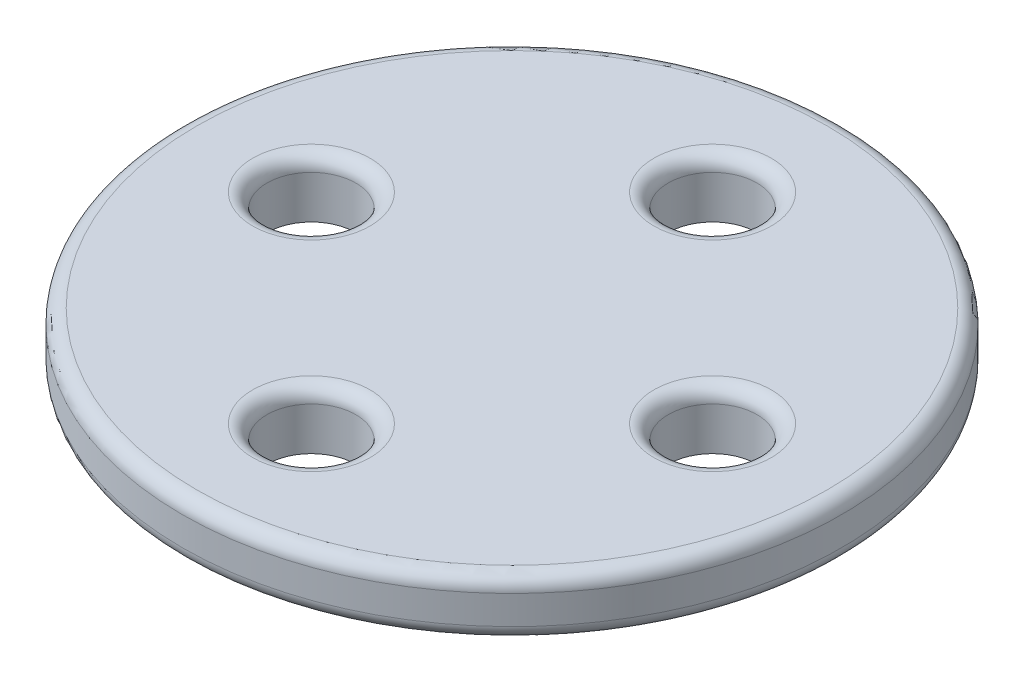
ISO-10303-21;
HEADER;
FILE_DESCRIPTION(('STEP AP214'),'2;1');
FILE_NAME('part.step','',(''),(''),'','','');
FILE_SCHEMA(('AUTOMOTIVE_DESIGN { 1 0 10303 214 1 1 1 1 }'));
ENDSEC;
DATA;
#1=APPLICATION_CONTEXT('core data for automotive mechanical design processes');
#2=APPLICATION_PROTOCOL_DEFINITION('international standard','automotive_design',2000,#1);
#3=PRODUCT_CONTEXT('',#1,'mechanical');
#4=PRODUCT('Part','Part','',(#3));
#5=PRODUCT_RELATED_PRODUCT_CATEGORY('part','',(#4));
#6=PRODUCT_DEFINITION_FORMATION('','',#4);
#7=PRODUCT_DEFINITION_CONTEXT('part definition',#1,'design');
#8=PRODUCT_DEFINITION('design','',#6,#7);
#9=PRODUCT_DEFINITION_SHAPE('','',#8);
#10=(LENGTH_UNIT() NAMED_UNIT(*) SI_UNIT(.MILLI.,.METRE.));
#11=(NAMED_UNIT(*) PLANE_ANGLE_UNIT() SI_UNIT($,.RADIAN.));
#12=(NAMED_UNIT(*) SI_UNIT($,.STERADIAN.) SOLID_ANGLE_UNIT());
#13=UNCERTAINTY_MEASURE_WITH_UNIT(LENGTH_MEASURE(1.E-05),#10,'distance_accuracy_value','');
#14=(GEOMETRIC_REPRESENTATION_CONTEXT(3) GLOBAL_UNCERTAINTY_ASSIGNED_CONTEXT((#13)) GLOBAL_UNIT_ASSIGNED_CONTEXT((#10,
#11,#12)) REPRESENTATION_CONTEXT('',''));
#15=CARTESIAN_POINT('',(0.,0.,0.));
#16=DIRECTION('',(0.,0.,1.));
#17=DIRECTION('',(1.,0.,0.));
#18=AXIS2_PLACEMENT_3D('',#15,#16,#17);
#19=CARTESIAN_POINT('',(0.,2.,0.));
#20=DIRECTION('',(0.,1.,0.));
#21=DIRECTION('',(0.,0.,1.));
#22=AXIS2_PLACEMENT_3D('',#19,#20,#21);
#23=PLANE('',#22);
#24=CARTESIAN_POINT('',(-6.99999999999982,2.,1.84544747626273E-13));
#25=DIRECTION('',(0.,1.,0.));
#26=DIRECTION('',(0.,0.,1.));
#27=AXIS2_PLACEMENT_3D('',#24,#25,#26);
#28=CIRCLE('',#27,2.05);
#29=CARTESIAN_POINT('',(-6.99999999999982,2.,2.05000000000019));
#30=VERTEX_POINT('',#29);
#31=EDGE_CURVE('E60',#30,#30,#28,.F.);
#32=ORIENTED_EDGE('',*,*,#31,.T.);
#33=EDGE_LOOP('',(#32));
#34=FACE_BOUND('',#33,.T.);
#35=CARTESIAN_POINT('',(7.00000000000018,2.,-1.8368749486687E-13));
#36=DIRECTION('',(0.,1.,0.));
#37=DIRECTION('',(0.,0.,1.));
#38=AXIS2_PLACEMENT_3D('',#35,#36,#37);
#39=CIRCLE('',#38,2.05);
#40=CARTESIAN_POINT('',(7.00000000000018,2.,2.04999999999982));
#41=VERTEX_POINT('',#40);
#42=EDGE_CURVE('E63',#41,#41,#39,.F.);
#43=ORIENTED_EDGE('',*,*,#42,.T.);
#44=EDGE_LOOP('',(#43));
#45=FACE_BOUND('',#44,.T.);
#46=CARTESIAN_POINT('',(0.,2.,0.));
#47=DIRECTION('',(0.,1.,0.));
#48=DIRECTION('',(0.,0.,1.));
#49=AXIS2_PLACEMENT_3D('',#46,#47,#48);
#50=CIRCLE('',#49,11.);
#51=CARTESIAN_POINT('',(0.,2.,11.));
#52=VERTEX_POINT('',#51);
#53=EDGE_CURVE('E66',#52,#52,#50,.T.);
#54=ORIENTED_EDGE('',*,*,#53,.T.);
#55=EDGE_LOOP('',(#54));
#56=FACE_BOUND('',#55,.T.);
#57=CARTESIAN_POINT('',(0.,2.,-7.));
#58=DIRECTION('',(0.,1.,0.));
#59=DIRECTION('',(0.,0.,1.));
#60=AXIS2_PLACEMENT_3D('',#57,#58,#59);
#61=CIRCLE('',#60,2.05);
#62=CARTESIAN_POINT('',(0.,2.,-4.95));
#63=VERTEX_POINT('',#62);
#64=EDGE_CURVE('E69',#63,#63,#61,.F.);
#65=ORIENTED_EDGE('',*,*,#64,.T.);
#66=EDGE_LOOP('',(#65));
#67=FACE_BOUND('',#66,.T.);
#68=CARTESIAN_POINT('',(3.67313757393783E-13,2.,7.));
#69=DIRECTION('',(0.,1.,0.));
#70=DIRECTION('',(0.,0.,1.));
#71=AXIS2_PLACEMENT_3D('',#68,#69,#70);
#72=CIRCLE('',#71,2.05);
#73=CARTESIAN_POINT('',(3.67313757393783E-13,2.,9.05));
#74=VERTEX_POINT('',#73);
#75=EDGE_CURVE('E72',#74,#74,#72,.F.);
#76=ORIENTED_EDGE('',*,*,#75,.T.);
#77=EDGE_LOOP('',(#76));
#78=FACE_BOUND('',#77,.T.);
#79=ADVANCED_FACE('F34',(#34,#45,#56,#67,#78),#23,.T.);
#80=CARTESIAN_POINT('',(0.,0.,0.));
#81=DIRECTION('',(0.,1.,0.));
#82=DIRECTION('',(0.,0.,1.));
#83=AXIS2_PLACEMENT_3D('',#80,#81,#82);
#84=PLANE('',#83);
#85=CARTESIAN_POINT('',(0.,0.,0.));
#86=DIRECTION('',(0.,1.,0.));
#87=DIRECTION('',(0.,0.,1.));
#88=AXIS2_PLACEMENT_3D('',#85,#86,#87);
#89=CIRCLE('',#88,11.);
#90=CARTESIAN_POINT('',(0.,0.,11.));
#91=VERTEX_POINT('',#90);
#92=EDGE_CURVE('E10',#91,#91,#89,.F.);
#93=ORIENTED_EDGE('',*,*,#92,.T.);
#94=EDGE_LOOP('',(#93));
#95=FACE_BOUND('',#94,.T.);
#96=CARTESIAN_POINT('',(0.,0.,-7.));
#97=DIRECTION('',(0.,1.,0.));
#98=DIRECTION('',(0.,0.,1.));
#99=AXIS2_PLACEMENT_3D('',#96,#97,#98);
#100=CIRCLE('',#99,1.55);
#101=CARTESIAN_POINT('',(0.,0.,-5.45));
#102=VERTEX_POINT('',#101);
#103=EDGE_CURVE('E78',#102,#102,#100,.T.);
#104=ORIENTED_EDGE('',*,*,#103,.T.);
#105=EDGE_LOOP('',(#104));
#106=FACE_BOUND('',#105,.T.);
#107=CARTESIAN_POINT('',(7.00000000000018,0.,-1.8368749486687E-13));
#108=DIRECTION('',(0.,1.,0.));
#109=DIRECTION('',(0.,0.,1.));
#110=AXIS2_PLACEMENT_3D('',#107,#108,#109);
#111=CIRCLE('',#110,1.55);
#112=CARTESIAN_POINT('',(7.00000000000018,0.,1.54999999999982));
#113=VERTEX_POINT('',#112);
#114=EDGE_CURVE('E81',#113,#113,#111,.T.);
#115=ORIENTED_EDGE('',*,*,#114,.T.);
#116=EDGE_LOOP('',(#115));
#117=FACE_BOUND('',#116,.T.);
#118=CARTESIAN_POINT('',(3.67313757393783E-13,0.,7.));
#119=DIRECTION('',(0.,1.,0.));
#120=DIRECTION('',(0.,0.,1.));
#121=AXIS2_PLACEMENT_3D('',#118,#119,#120);
#122=CIRCLE('',#121,1.55);
#123=CARTESIAN_POINT('',(3.67313757393783E-13,0.,8.55));
#124=VERTEX_POINT('',#123);
#125=EDGE_CURVE('E84',#124,#124,#122,.T.);
#126=ORIENTED_EDGE('',*,*,#125,.T.);
#127=EDGE_LOOP('',(#126));
#128=FACE_BOUND('',#127,.T.);
#129=CARTESIAN_POINT('',(-6.99999999999982,0.,1.84544747626273E-13));
#130=DIRECTION('',(0.,1.,0.));
#131=DIRECTION('',(0.,0.,1.));
#132=AXIS2_PLACEMENT_3D('',#129,#130,#131);
#133=CIRCLE('',#132,1.55);
#134=CARTESIAN_POINT('',(-6.99999999999982,0.,1.55000000000018));
#135=VERTEX_POINT('',#134);
#136=EDGE_CURVE('E87',#135,#135,#133,.T.);
#137=ORIENTED_EDGE('',*,*,#136,.T.);
#138=EDGE_LOOP('',(#137));
#139=FACE_BOUND('',#138,.T.);
#140=ADVANCED_FACE('F91',(#95,#106,#117,#128,#139),#84,.F.);
#141=CARTESIAN_POINT('',(0.,2.,0.));
#142=DIRECTION('',(0.,-1.,0.));
#143=DIRECTION('',(0.,0.,-1.));
#144=AXIS2_PLACEMENT_3D('',#141,#142,#143);
#145=CYLINDRICAL_SURFACE('',#144,11.5);
#146=CARTESIAN_POINT('',(0.,1.5,0.));
#147=DIRECTION('',(0.,1.,0.));
#148=DIRECTION('',(0.,0.,1.));
#149=AXIS2_PLACEMENT_3D('',#146,#147,#148);
#150=CIRCLE('',#149,11.5);
#151=CARTESIAN_POINT('',(0.,1.5,11.5));
#152=VERTEX_POINT('',#151);
#153=EDGE_CURVE('E49',#152,#152,#150,.F.);
#154=ORIENTED_EDGE('',*,*,#153,.T.);
#155=EDGE_LOOP('',(#154));
#156=FACE_BOUND('',#155,.T.);
#157=CARTESIAN_POINT('',(0.,0.5,0.));
#158=DIRECTION('',(0.,1.,0.));
#159=DIRECTION('',(0.,0.,1.));
#160=AXIS2_PLACEMENT_3D('',#157,#158,#159);
#161=CIRCLE('',#160,11.5);
#162=CARTESIAN_POINT('',(0.,0.5,11.5));
#163=VERTEX_POINT('',#162);
#164=EDGE_CURVE('E54',#163,#163,#161,.T.);
#165=ORIENTED_EDGE('',*,*,#164,.T.);
#166=EDGE_LOOP('',(#165));
#167=FACE_BOUND('',#166,.T.);
#168=ADVANCED_FACE('F114',(#156,#167),#145,.T.);
#169=CARTESIAN_POINT('',(0.,2.,-7.));
#170=DIRECTION('',(0.,-1.,0.));
#171=DIRECTION('',(0.,0.,-1.));
#172=AXIS2_PLACEMENT_3D('',#169,#170,#171);
#173=CYLINDRICAL_SURFACE('',#172,1.55);
#174=CARTESIAN_POINT('',(0.,1.5,-7.));
#175=DIRECTION('',(0.,1.,0.));
#176=DIRECTION('',(0.,0.,1.));
#177=AXIS2_PLACEMENT_3D('',#174,#175,#176);
#178=CIRCLE('',#177,1.55);
#179=CARTESIAN_POINT('',(0.,1.5,-5.45));
#180=VERTEX_POINT('',#179);
#181=EDGE_CURVE('E45',#180,#180,#178,.T.);
#182=ORIENTED_EDGE('',*,*,#181,.T.);
#183=EDGE_LOOP('',(#182));
#184=FACE_BOUND('',#183,.T.);
#185=ORIENTED_EDGE('',*,*,#103,.F.);
#186=EDGE_LOOP('',(#185));
#187=FACE_BOUND('',#186,.T.);
#188=ADVANCED_FACE('F118',(#184,#187),#173,.F.);
#189=CARTESIAN_POINT('',(7.00000000000018,2.,-1.8368749486687E-13));
#190=DIRECTION('',(0.,-1.,0.));
#191=DIRECTION('',(0.,0.,-1.));
#192=AXIS2_PLACEMENT_3D('',#189,#190,#191);
#193=CYLINDRICAL_SURFACE('',#192,1.55);
#194=CARTESIAN_POINT('',(7.00000000000018,1.5,-1.8368749486687E-13));
#195=DIRECTION('',(0.,1.,0.));
#196=DIRECTION('',(0.,0.,1.));
#197=AXIS2_PLACEMENT_3D('',#194,#195,#196);
#198=CIRCLE('',#197,1.55);
#199=CARTESIAN_POINT('',(7.00000000000018,1.5,1.54999999999982));
#200=VERTEX_POINT('',#199);
#201=EDGE_CURVE('E57',#200,#200,#198,.T.);
#202=ORIENTED_EDGE('',*,*,#201,.T.);
#203=EDGE_LOOP('',(#202));
#204=FACE_BOUND('',#203,.T.);
#205=ORIENTED_EDGE('',*,*,#114,.F.);
#206=EDGE_LOOP('',(#205));
#207=FACE_BOUND('',#206,.T.);
#208=ADVANCED_FACE('F106',(#204,#207),#193,.F.);
#209=CARTESIAN_POINT('',(3.67313757393783E-13,2.,7.));
#210=DIRECTION('',(0.,-1.,0.));
#211=DIRECTION('',(0.,0.,-1.));
#212=AXIS2_PLACEMENT_3D('',#209,#210,#211);
#213=CYLINDRICAL_SURFACE('',#212,1.55);
#214=CARTESIAN_POINT('',(3.67313757393783E-13,1.5,7.));
#215=DIRECTION('',(0.,1.,0.));
#216=DIRECTION('',(0.,0.,1.));
#217=AXIS2_PLACEMENT_3D('',#214,#215,#216);
#218=CIRCLE('',#217,1.55);
#219=CARTESIAN_POINT('',(3.67313757393783E-13,1.5,8.55));
#220=VERTEX_POINT('',#219);
#221=EDGE_CURVE('E41',#220,#220,#218,.T.);
#222=ORIENTED_EDGE('',*,*,#221,.T.);
#223=EDGE_LOOP('',(#222));
#224=FACE_BOUND('',#223,.T.);
#225=ORIENTED_EDGE('',*,*,#125,.F.);
#226=EDGE_LOOP('',(#225));
#227=FACE_BOUND('',#226,.T.);
#228=ADVANCED_FACE('F96',(#224,#227),#213,.F.);
#229=CARTESIAN_POINT('',(-6.99999999999982,2.,1.84544747626273E-13));
#230=DIRECTION('',(0.,-1.,0.));
#231=DIRECTION('',(0.,0.,-1.));
#232=AXIS2_PLACEMENT_3D('',#229,#230,#231);
#233=CYLINDRICAL_SURFACE('',#232,1.55);
#234=CARTESIAN_POINT('',(-6.99999999999982,1.5,1.84544747626273E-13));
#235=DIRECTION('',(0.,1.,0.));
#236=DIRECTION('',(0.,0.,1.));
#237=AXIS2_PLACEMENT_3D('',#234,#235,#236);
#238=CIRCLE('',#237,1.55);
#239=CARTESIAN_POINT('',(-6.99999999999982,1.5,1.55000000000018));
#240=VERTEX_POINT('',#239);
#241=EDGE_CURVE('E75',#240,#240,#238,.T.);
#242=ORIENTED_EDGE('',*,*,#241,.T.);
#243=EDGE_LOOP('',(#242));
#244=FACE_BOUND('',#243,.T.);
#245=ORIENTED_EDGE('',*,*,#136,.F.);
#246=EDGE_LOOP('',(#245));
#247=FACE_BOUND('',#246,.T.);
#248=ADVANCED_FACE('F93',(#244,#247),#233,.F.);
#249=CARTESIAN_POINT('',(-6.99999999999982,1.5,1.84544747626273E-13));
#250=DIRECTION('',(0.,1.,0.));
#251=DIRECTION('',(0.,0.,1.));
#252=AXIS2_PLACEMENT_3D('',#249,#250,#251);
#253=TOROIDAL_SURFACE('',#252,2.05,0.5);
#254=ORIENTED_EDGE('',*,*,#31,.F.);
#255=EDGE_LOOP('',(#254));
#256=FACE_BOUND('',#255,.T.);
#257=ORIENTED_EDGE('',*,*,#241,.F.);
#258=EDGE_LOOP('',(#257));
#259=FACE_BOUND('',#258,.T.);
#260=ADVANCED_FACE('F95',(#256,#259),#253,.T.);
#261=CARTESIAN_POINT('',(7.00000000000018,1.5,-1.8368749486687E-13));
#262=DIRECTION('',(0.,1.,0.));
#263=DIRECTION('',(0.,0.,1.));
#264=AXIS2_PLACEMENT_3D('',#261,#262,#263);
#265=TOROIDAL_SURFACE('',#264,2.05,0.5);
#266=ORIENTED_EDGE('',*,*,#42,.F.);
#267=EDGE_LOOP('',(#266));
#268=FACE_BOUND('',#267,.T.);
#269=ORIENTED_EDGE('',*,*,#201,.F.);
#270=EDGE_LOOP('',(#269));
#271=FACE_BOUND('',#270,.T.);
#272=ADVANCED_FACE('F103',(#268,#271),#265,.T.);
#273=CARTESIAN_POINT('',(0.,1.5,0.));
#274=DIRECTION('',(0.,1.,0.));
#275=DIRECTION('',(0.,0.,1.));
#276=AXIS2_PLACEMENT_3D('',#273,#274,#275);
#277=TOROIDAL_SURFACE('',#276,11.,0.5);
#278=ORIENTED_EDGE('',*,*,#153,.F.);
#279=EDGE_LOOP('',(#278));
#280=FACE_BOUND('',#279,.T.);
#281=ORIENTED_EDGE('',*,*,#53,.F.);
#282=EDGE_LOOP('',(#281));
#283=FACE_BOUND('',#282,.T.);
#284=ADVANCED_FACE('F126',(#280,#283),#277,.T.);
#285=CARTESIAN_POINT('',(0.,1.5,-7.));
#286=DIRECTION('',(0.,1.,0.));
#287=DIRECTION('',(0.,0.,1.));
#288=AXIS2_PLACEMENT_3D('',#285,#286,#287);
#289=TOROIDAL_SURFACE('',#288,2.05,0.5);
#290=ORIENTED_EDGE('',*,*,#64,.F.);
#291=EDGE_LOOP('',(#290));
#292=FACE_BOUND('',#291,.T.);
#293=ORIENTED_EDGE('',*,*,#181,.F.);
#294=EDGE_LOOP('',(#293));
#295=FACE_BOUND('',#294,.T.);
#296=ADVANCED_FACE('F130',(#292,#295),#289,.T.);
#297=CARTESIAN_POINT('',(3.67313757393783E-13,1.5,7.));
#298=DIRECTION('',(0.,1.,0.));
#299=DIRECTION('',(0.,0.,1.));
#300=AXIS2_PLACEMENT_3D('',#297,#298,#299);
#301=TOROIDAL_SURFACE('',#300,2.05,0.5);
#302=ORIENTED_EDGE('',*,*,#75,.F.);
#303=EDGE_LOOP('',(#302));
#304=FACE_BOUND('',#303,.T.);
#305=ORIENTED_EDGE('',*,*,#221,.F.);
#306=EDGE_LOOP('',(#305));
#307=FACE_BOUND('',#306,.T.);
#308=ADVANCED_FACE('F133',(#304,#307),#301,.T.);
#309=CARTESIAN_POINT('',(0.,0.5,0.));
#310=DIRECTION('',(0.,1.,0.));
#311=DIRECTION('',(0.,0.,1.));
#312=AXIS2_PLACEMENT_3D('',#309,#310,#311);
#313=TOROIDAL_SURFACE('',#312,11.,0.5);
#314=ORIENTED_EDGE('',*,*,#92,.F.);
#315=EDGE_LOOP('',(#314));
#316=FACE_BOUND('',#315,.T.);
#317=ORIENTED_EDGE('',*,*,#164,.F.);
#318=EDGE_LOOP('',(#317));
#319=FACE_BOUND('',#318,.T.);
#320=ADVANCED_FACE('F36',(#316,#319),#313,.T.);
#321=CLOSED_SHELL('',(#79,#140,#168,#188,#208,#228,#248,#260,#272,#284,#296,#308,#320));
#322=MANIFOLD_SOLID_BREP('B2',#321);
#323=ADVANCED_BREP_SHAPE_REPRESENTATION('',(#18,#322),#14);
#324=SHAPE_DEFINITION_REPRESENTATION(#9,#323);
ENDSEC;
END-ISO-10303-21;
